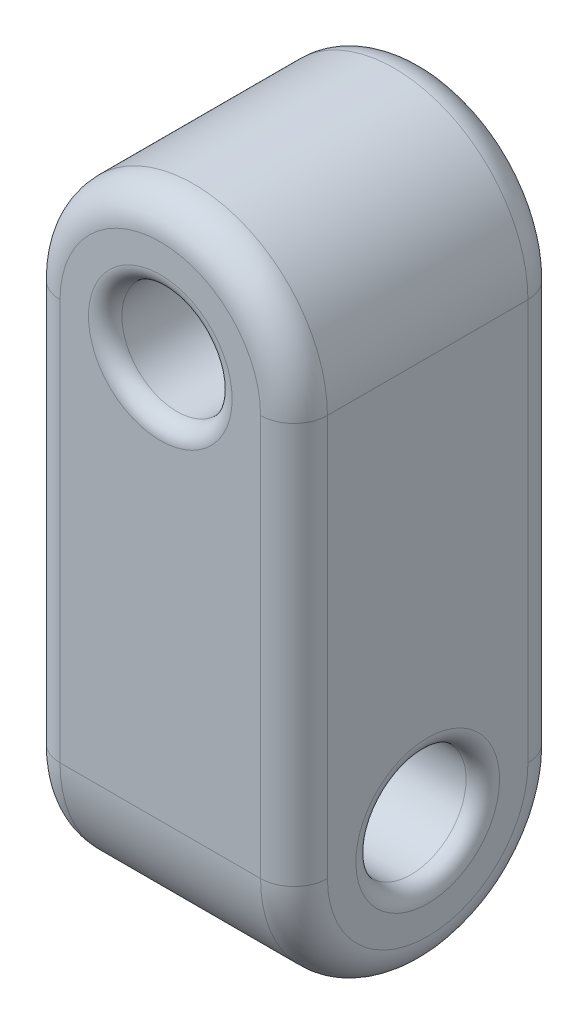
ISO-10303-21;
HEADER;
FILE_DESCRIPTION(('STEP AP214'),'2;1');
FILE_NAME('part.step','',(''),(''),'','','');
FILE_SCHEMA(('AUTOMOTIVE_DESIGN { 1 0 10303 214 1 1 1 1 }'));
ENDSEC;
DATA;
#1=APPLICATION_CONTEXT('core data for automotive mechanical design processes');
#2=APPLICATION_PROTOCOL_DEFINITION('international standard','automotive_design',2000,#1);
#3=PRODUCT_CONTEXT('',#1,'mechanical');
#4=PRODUCT('Part','Part','',(#3));
#5=PRODUCT_RELATED_PRODUCT_CATEGORY('part','',(#4));
#6=PRODUCT_DEFINITION_FORMATION('','',#4);
#7=PRODUCT_DEFINITION_CONTEXT('part definition',#1,'design');
#8=PRODUCT_DEFINITION('design','',#6,#7);
#9=PRODUCT_DEFINITION_SHAPE('','',#8);
#10=(LENGTH_UNIT() NAMED_UNIT(*) SI_UNIT(.MILLI.,.METRE.));
#11=(NAMED_UNIT(*) PLANE_ANGLE_UNIT() SI_UNIT($,.RADIAN.));
#12=(NAMED_UNIT(*) SI_UNIT($,.STERADIAN.) SOLID_ANGLE_UNIT());
#13=UNCERTAINTY_MEASURE_WITH_UNIT(LENGTH_MEASURE(1.E-05),#10,'distance_accuracy_value','');
#14=(GEOMETRIC_REPRESENTATION_CONTEXT(3) GLOBAL_UNCERTAINTY_ASSIGNED_CONTEXT((#13)) GLOBAL_UNIT_ASSIGNED_CONTEXT((#10,
#11,#12)) REPRESENTATION_CONTEXT('',''));
#15=CARTESIAN_POINT('',(0.,0.,0.));
#16=DIRECTION('',(0.,0.,1.));
#17=DIRECTION('',(1.,0.,0.));
#18=AXIS2_PLACEMENT_3D('',#15,#16,#17);
#19=CARTESIAN_POINT('',(0.,0.,8.8));
#20=DIRECTION('',(0.,0.,-1.));
#21=DIRECTION('',(-1.,0.,0.));
#22=AXIS2_PLACEMENT_3D('',#19,#20,#21);
#23=CYLINDRICAL_SURFACE('',#22,4.);
#24=DIRECTION('',(0.,0.,-1.));
#25=VECTOR('',#24,1.);
#26=CARTESIAN_POINT('',(-4.,0.,8.8));
#27=LINE('',#26,#25);
#28=CARTESIAN_POINT('',(-4.,0.,7.8));
#29=VERTEX_POINT('',#28);
#30=CARTESIAN_POINT('',(-4.,0.,1.8));
#31=VERTEX_POINT('',#30);
#32=EDGE_CURVE('E146',#29,#31,#27,.T.);
#33=ORIENTED_EDGE('',*,*,#32,.F.);
#34=CARTESIAN_POINT('',(0.,0.,7.8));
#35=DIRECTION('',(0.,0.,1.));
#36=DIRECTION('',(1.,0.,0.));
#37=AXIS2_PLACEMENT_3D('',#34,#35,#36);
#38=CIRCLE('',#37,4.);
#39=CARTESIAN_POINT('',(4.,0.,7.8));
#40=VERTEX_POINT('',#39);
#41=EDGE_CURVE('E166',#29,#40,#38,.F.);
#42=ORIENTED_EDGE('',*,*,#41,.T.);
#43=DIRECTION('',(0.,0.,-1.));
#44=VECTOR('',#43,1.);
#45=CARTESIAN_POINT('',(4.,0.,8.8));
#46=LINE('',#45,#44);
#47=CARTESIAN_POINT('',(4.,0.,1.8));
#48=VERTEX_POINT('',#47);
#49=EDGE_CURVE('E138',#40,#48,#46,.T.);
#50=ORIENTED_EDGE('',*,*,#49,.T.);
#51=CARTESIAN_POINT('',(0.,0.,1.8));
#52=DIRECTION('',(0.,0.,1.));
#53=DIRECTION('',(1.,0.,0.));
#54=AXIS2_PLACEMENT_3D('',#51,#52,#53);
#55=CIRCLE('',#54,4.);
#56=EDGE_CURVE('E164',#48,#31,#55,.T.);
#57=ORIENTED_EDGE('',*,*,#56,.T.);
#58=EDGE_LOOP('',(#33,#42,#50,#57));
#59=FACE_BOUND('',#58,.T.);
#60=ADVANCED_FACE('F34',(#59),#23,.T.);
#61=CARTESIAN_POINT('',(0.,0.,8.8));
#62=DIRECTION('',(0.,0.,1.));
#63=DIRECTION('',(1.,0.,0.));
#64=AXIS2_PLACEMENT_3D('',#61,#62,#63);
#65=PLANE('',#64);
#66=CARTESIAN_POINT('',(0.,0.,8.8));
#67=DIRECTION('',(0.,0.,1.));
#68=DIRECTION('',(1.,0.,0.));
#69=AXIS2_PLACEMENT_3D('',#66,#67,#68);
#70=CIRCLE('',#69,2.15);
#71=CARTESIAN_POINT('',(2.15,0.,8.8));
#72=VERTEX_POINT('',#71);
#73=EDGE_CURVE('E193',#72,#72,#70,.F.);
#74=ORIENTED_EDGE('',*,*,#73,.T.);
#75=EDGE_LOOP('',(#74));
#76=FACE_BOUND('',#75,.T.);
#77=DIRECTION('',(-1.,0.,0.));
#78=VECTOR('',#77,1.);
#79=CARTESIAN_POINT('',(4.,-12.,8.8));
#80=LINE('',#79,#78);
#81=CARTESIAN_POINT('',(3.,-12.,8.8));
#82=VERTEX_POINT('',#81);
#83=CARTESIAN_POINT('',(-3.,-12.,8.8));
#84=VERTEX_POINT('',#83);
#85=EDGE_CURVE('E135',#82,#84,#80,.T.);
#86=ORIENTED_EDGE('',*,*,#85,.F.);
#87=DIRECTION('',(0.,-1.,0.));
#88=VECTOR('',#87,1.);
#89=CARTESIAN_POINT('',(3.,0.,8.8));
#90=LINE('',#89,#88);
#91=CARTESIAN_POINT('',(3.,0.,8.8));
#92=VERTEX_POINT('',#91);
#93=EDGE_CURVE('E158',#82,#92,#90,.F.);
#94=ORIENTED_EDGE('',*,*,#93,.T.);
#95=CARTESIAN_POINT('',(0.,0.,8.8));
#96=DIRECTION('',(0.,0.,1.));
#97=DIRECTION('',(1.,0.,0.));
#98=AXIS2_PLACEMENT_3D('',#95,#96,#97);
#99=CIRCLE('',#98,3.);
#100=CARTESIAN_POINT('',(-3.,0.,8.8));
#101=VERTEX_POINT('',#100);
#102=EDGE_CURVE('E119',#92,#101,#99,.T.);
#103=ORIENTED_EDGE('',*,*,#102,.T.);
#104=DIRECTION('',(0.,-1.,0.));
#105=VECTOR('',#104,1.);
#106=CARTESIAN_POINT('',(-3.,-12.,8.8));
#107=LINE('',#106,#105);
#108=EDGE_CURVE('E156',#101,#84,#107,.T.);
#109=ORIENTED_EDGE('',*,*,#108,.T.);
#110=EDGE_LOOP('',(#86,#94,#103,#109));
#111=FACE_BOUND('',#110,.T.);
#112=ADVANCED_FACE('F210',(#76,#111),#65,.T.);
#113=CARTESIAN_POINT('',(0.,0.,0.8));
#114=DIRECTION('',(0.,0.,1.));
#115=DIRECTION('',(1.,0.,0.));
#116=AXIS2_PLACEMENT_3D('',#113,#114,#115);
#117=PLANE('',#116);
#118=CARTESIAN_POINT('',(0.,0.,0.8));
#119=DIRECTION('',(0.,0.,1.));
#120=DIRECTION('',(1.,0.,0.));
#121=AXIS2_PLACEMENT_3D('',#118,#119,#120);
#122=CIRCLE('',#121,2.15);
#123=CARTESIAN_POINT('',(2.15,0.,0.8));
#124=VERTEX_POINT('',#123);
#125=EDGE_CURVE('E11',#124,#124,#122,.T.);
#126=ORIENTED_EDGE('',*,*,#125,.T.);
#127=EDGE_LOOP('',(#126));
#128=FACE_BOUND('',#127,.T.);
#129=CARTESIAN_POINT('',(0.,0.,0.8));
#130=DIRECTION('',(0.,0.,1.));
#131=DIRECTION('',(1.,0.,0.));
#132=AXIS2_PLACEMENT_3D('',#129,#130,#131);
#133=CIRCLE('',#132,3.);
#134=CARTESIAN_POINT('',(-3.,0.,0.8));
#135=VERTEX_POINT('',#134);
#136=CARTESIAN_POINT('',(3.,0.,0.8));
#137=VERTEX_POINT('',#136);
#138=EDGE_CURVE('E128',#135,#137,#133,.F.);
#139=ORIENTED_EDGE('',*,*,#138,.T.);
#140=DIRECTION('',(0.,-1.,0.));
#141=VECTOR('',#140,1.);
#142=CARTESIAN_POINT('',(3.,-12.,0.8));
#143=LINE('',#142,#141);
#144=CARTESIAN_POINT('',(3.,-12.,0.8));
#145=VERTEX_POINT('',#144);
#146=EDGE_CURVE('E103',#137,#145,#143,.T.);
#147=ORIENTED_EDGE('',*,*,#146,.T.);
#148=DIRECTION('',(-1.,0.,0.));
#149=VECTOR('',#148,1.);
#150=CARTESIAN_POINT('',(4.,-12.,0.8));
#151=LINE('',#150,#149);
#152=CARTESIAN_POINT('',(-3.,-12.,0.8));
#153=VERTEX_POINT('',#152);
#154=EDGE_CURVE('E125',#145,#153,#151,.T.);
#155=ORIENTED_EDGE('',*,*,#154,.T.);
#156=DIRECTION('',(0.,-1.,0.));
#157=VECTOR('',#156,1.);
#158=CARTESIAN_POINT('',(-3.,0.,0.8));
#159=LINE('',#158,#157);
#160=EDGE_CURVE('E131',#153,#135,#159,.F.);
#161=ORIENTED_EDGE('',*,*,#160,.T.);
#162=EDGE_LOOP('',(#139,#147,#155,#161));
#163=FACE_BOUND('',#162,.T.);
#164=ADVANCED_FACE('F124',(#128,#163),#117,.F.);
#165=CARTESIAN_POINT('',(-4.,0.,8.8));
#166=DIRECTION('',(1.,0.,0.));
#167=DIRECTION('',(0.,0.,-1.));
#168=AXIS2_PLACEMENT_3D('',#165,#166,#167);
#169=PLANE('',#168);
#170=CARTESIAN_POINT('',(-4.,-12.,4.8));
#171=DIRECTION('',(1.,0.,0.));
#172=DIRECTION('',(0.,0.,-1.));
#173=AXIS2_PLACEMENT_3D('',#170,#171,#172);
#174=CIRCLE('',#173,2.15);
#175=CARTESIAN_POINT('',(-4.,-12.,2.65));
#176=VERTEX_POINT('',#175);
#177=EDGE_CURVE('E167',#176,#176,#174,.T.);
#178=ORIENTED_EDGE('',*,*,#177,.T.);
#179=EDGE_LOOP('',(#178));
#180=FACE_BOUND('',#179,.T.);
#181=CARTESIAN_POINT('',(-4.,-12.,4.8));
#182=DIRECTION('',(1.,0.,0.));
#183=DIRECTION('',(0.,0.,-1.));
#184=AXIS2_PLACEMENT_3D('',#181,#182,#183);
#185=CIRCLE('',#184,3.);
#186=CARTESIAN_POINT('',(-4.,-12.,1.8));
#187=VERTEX_POINT('',#186);
#188=CARTESIAN_POINT('',(-4.,-12.,7.8));
#189=VERTEX_POINT('',#188);
#190=EDGE_CURVE('E49',#187,#189,#185,.F.);
#191=ORIENTED_EDGE('',*,*,#190,.T.);
#192=DIRECTION('',(0.,-1.,0.));
#193=VECTOR('',#192,1.);
#194=CARTESIAN_POINT('',(-4.,0.,7.8));
#195=LINE('',#194,#193);
#196=EDGE_CURVE('E162',#189,#29,#195,.F.);
#197=ORIENTED_EDGE('',*,*,#196,.T.);
#198=ORIENTED_EDGE('',*,*,#32,.T.);
#199=DIRECTION('',(0.,-1.,0.));
#200=VECTOR('',#199,1.);
#201=CARTESIAN_POINT('',(-4.,0.,1.8));
#202=LINE('',#201,#200);
#203=EDGE_CURVE('E54',#31,#187,#202,.T.);
#204=ORIENTED_EDGE('',*,*,#203,.T.);
#205=EDGE_LOOP('',(#191,#197,#198,#204));
#206=FACE_BOUND('',#205,.T.);
#207=ADVANCED_FACE('F242',(#180,#206),#169,.F.);
#208=CARTESIAN_POINT('',(4.,0.,8.8));
#209=DIRECTION('',(1.,0.,0.));
#210=DIRECTION('',(0.,1.,0.));
#211=AXIS2_PLACEMENT_3D('',#208,#209,#210);
#212=PLANE('',#211);
#213=CARTESIAN_POINT('',(4.,-12.,4.8));
#214=DIRECTION('',(1.,0.,0.));
#215=DIRECTION('',(0.,1.,0.));
#216=AXIS2_PLACEMENT_3D('',#213,#214,#215);
#217=CIRCLE('',#216,2.15);
#218=CARTESIAN_POINT('',(4.,-9.85,4.8));
#219=VERTEX_POINT('',#218);
#220=EDGE_CURVE('E190',#219,#219,#217,.F.);
#221=ORIENTED_EDGE('',*,*,#220,.T.);
#222=EDGE_LOOP('',(#221));
#223=FACE_BOUND('',#222,.T.);
#224=CARTESIAN_POINT('',(4.,-12.,4.8));
#225=DIRECTION('',(1.,0.,0.));
#226=DIRECTION('',(0.,1.,0.));
#227=AXIS2_PLACEMENT_3D('',#224,#225,#226);
#228=CIRCLE('',#227,3.);
#229=CARTESIAN_POINT('',(4.,-12.,7.8));
#230=VERTEX_POINT('',#229);
#231=CARTESIAN_POINT('',(4.,-12.,1.8));
#232=VERTEX_POINT('',#231);
#233=EDGE_CURVE('E151',#230,#232,#228,.T.);
#234=ORIENTED_EDGE('',*,*,#233,.T.);
#235=DIRECTION('',(0.,-1.,0.));
#236=VECTOR('',#235,1.);
#237=CARTESIAN_POINT('',(4.,0.,1.8));
#238=LINE('',#237,#236);
#239=EDGE_CURVE('E105',#232,#48,#238,.F.);
#240=ORIENTED_EDGE('',*,*,#239,.T.);
#241=ORIENTED_EDGE('',*,*,#49,.F.);
#242=DIRECTION('',(0.,-1.,0.));
#243=VECTOR('',#242,1.);
#244=CARTESIAN_POINT('',(4.,0.,7.8));
#245=LINE('',#244,#243);
#246=EDGE_CURVE('E130',#40,#230,#245,.T.);
#247=ORIENTED_EDGE('',*,*,#246,.T.);
#248=EDGE_LOOP('',(#234,#240,#241,#247));
#249=FACE_BOUND('',#248,.T.);
#250=ADVANCED_FACE('F241',(#223,#249),#212,.T.);
#251=CARTESIAN_POINT('',(-4.,-12.,4.8));
#252=DIRECTION('',(1.,0.,0.));
#253=DIRECTION('',(0.,0.,-1.));
#254=AXIS2_PLACEMENT_3D('',#251,#252,#253);
#255=CYLINDRICAL_SURFACE('',#254,4.);
#256=ORIENTED_EDGE('',*,*,#154,.F.);
#257=CARTESIAN_POINT('',(3.,-12.,4.8));
#258=DIRECTION('',(1.,0.,0.));
#259=DIRECTION('',(0.,1.,0.));
#260=AXIS2_PLACEMENT_3D('',#257,#258,#259);
#261=CIRCLE('',#260,4.);
#262=EDGE_CURVE('E111',#145,#82,#261,.F.);
#263=ORIENTED_EDGE('',*,*,#262,.T.);
#264=ORIENTED_EDGE('',*,*,#85,.T.);
#265=CARTESIAN_POINT('',(-3.,-12.,4.8));
#266=DIRECTION('',(1.,0.,0.));
#267=DIRECTION('',(0.,0.,-1.));
#268=AXIS2_PLACEMENT_3D('',#265,#266,#267);
#269=CIRCLE('',#268,4.);
#270=EDGE_CURVE('E120',#84,#153,#269,.T.);
#271=ORIENTED_EDGE('',*,*,#270,.T.);
#272=EDGE_LOOP('',(#256,#263,#264,#271));
#273=FACE_BOUND('',#272,.T.);
#274=ADVANCED_FACE('F133',(#273),#255,.T.);
#275=CARTESIAN_POINT('',(0.,0.,9.6));
#276=DIRECTION('',(0.,0.,-1.));
#277=DIRECTION('',(-1.,0.,0.));
#278=AXIS2_PLACEMENT_3D('',#275,#276,#277);
#279=CYLINDRICAL_SURFACE('',#278,1.65);
#280=CARTESIAN_POINT('',(0.,0.,8.3));
#281=DIRECTION('',(0.,0.,1.));
#282=DIRECTION('',(1.,0.,0.));
#283=AXIS2_PLACEMENT_3D('',#280,#281,#282);
#284=CIRCLE('',#283,1.65);
#285=CARTESIAN_POINT('',(1.65,0.,8.3));
#286=VERTEX_POINT('',#285);
#287=EDGE_CURVE('E42',#286,#286,#284,.T.);
#288=ORIENTED_EDGE('',*,*,#287,.T.);
#289=EDGE_LOOP('',(#288));
#290=FACE_BOUND('',#289,.T.);
#291=CARTESIAN_POINT('',(0.,0.,1.3));
#292=DIRECTION('',(0.,0.,1.));
#293=DIRECTION('',(1.,0.,0.));
#294=AXIS2_PLACEMENT_3D('',#291,#292,#293);
#295=CIRCLE('',#294,1.65);
#296=CARTESIAN_POINT('',(1.65,0.,1.3));
#297=VERTEX_POINT('',#296);
#298=EDGE_CURVE('E196',#297,#297,#295,.F.);
#299=ORIENTED_EDGE('',*,*,#298,.T.);
#300=EDGE_LOOP('',(#299));
#301=FACE_BOUND('',#300,.T.);
#302=ADVANCED_FACE('F201',(#290,#301),#279,.F.);
#303=CARTESIAN_POINT('',(-4.975,-12.,4.8));
#304=DIRECTION('',(1.,0.,0.));
#305=DIRECTION('',(0.,0.,-1.));
#306=AXIS2_PLACEMENT_3D('',#303,#304,#305);
#307=CYLINDRICAL_SURFACE('',#306,1.65);
#308=CARTESIAN_POINT('',(-3.5,-12.,4.8));
#309=DIRECTION('',(1.,0.,0.));
#310=DIRECTION('',(0.,0.,-1.));
#311=AXIS2_PLACEMENT_3D('',#308,#309,#310);
#312=CIRCLE('',#311,1.65);
#313=CARTESIAN_POINT('',(-3.5,-12.,3.15));
#314=VERTEX_POINT('',#313);
#315=EDGE_CURVE('E187',#314,#314,#312,.F.);
#316=CARTESIAN_POINT('',(3.5,-12.,4.8));
#317=DIRECTION('',(1.,0.,0.));
#318=DIRECTION('',(0.,1.,0.));
#319=AXIS2_PLACEMENT_3D('',#316,#317,#318);
#320=CIRCLE('',#319,1.65);
#321=CARTESIAN_POINT('',(3.5,-12.,3.15));
#322=VERTEX_POINT('',#321);
#323=EDGE_CURVE('E184',#322,#322,#320,.T.);
#324=CARTESIAN_POINT('',(-3.5,-12.,3.15));
#325=CARTESIAN_POINT('',(-3.42708333333333,-12.,3.15));
#326=CARTESIAN_POINT('',(-3.35416666666667,-12.,3.15));
#327=CARTESIAN_POINT('',(-3.20833333333333,-12.,3.15));
#328=CARTESIAN_POINT('',(-3.13541666666667,-12.,3.15));
#329=CARTESIAN_POINT('',(-2.98958333333333,-12.,3.15));
#330=CARTESIAN_POINT('',(-2.91666666666667,-12.,3.15));
#331=CARTESIAN_POINT('',(-2.77083333333333,-12.,3.15));
#332=CARTESIAN_POINT('',(-2.69791666666667,-12.,3.15));
#333=CARTESIAN_POINT('',(-2.55208333333333,-12.,3.15));
#334=CARTESIAN_POINT('',(-2.47916666666667,-12.,3.15));
#335=CARTESIAN_POINT('',(-2.33333333333333,-12.,3.15));
#336=CARTESIAN_POINT('',(-2.26041666666667,-12.,3.15));
#337=CARTESIAN_POINT('',(-2.11458333333333,-12.,3.15));
#338=CARTESIAN_POINT('',(-2.04166666666667,-12.,3.15));
#339=CARTESIAN_POINT('',(-1.89583333333333,-12.,3.15));
#340=CARTESIAN_POINT('',(-1.82291666666667,-12.,3.15));
#341=CARTESIAN_POINT('',(-1.67708333333333,-12.,3.15));
#342=CARTESIAN_POINT('',(-1.60416666666667,-12.,3.15));
#343=CARTESIAN_POINT('',(-1.45833333333333,-12.,3.15));
#344=CARTESIAN_POINT('',(-1.38541666666667,-12.,3.15));
#345=CARTESIAN_POINT('',(-1.23958333333333,-12.,3.15));
#346=CARTESIAN_POINT('',(-1.16666666666667,-12.,3.15));
#347=CARTESIAN_POINT('',(-1.02083333333334,-12.,3.15));
#348=CARTESIAN_POINT('',(-0.947916666666669,-12.,3.15));
#349=CARTESIAN_POINT('',(-0.802083333333336,-12.,3.15));
#350=CARTESIAN_POINT('',(-0.729166666666669,-12.,3.15));
#351=CARTESIAN_POINT('',(-0.583333333333336,-12.,3.15));
#352=CARTESIAN_POINT('',(-0.510416666666669,-12.,3.15));
#353=CARTESIAN_POINT('',(-0.364583333333335,-12.,3.15));
#354=CARTESIAN_POINT('',(-0.291666666666669,-12.,3.15));
#355=CARTESIAN_POINT('',(-0.145833333333335,-12.,3.15));
#356=CARTESIAN_POINT('',(-0.0729166666666684,-12.,3.15));
#357=CARTESIAN_POINT('',(0.0729166666666647,-12.,3.15));
#358=CARTESIAN_POINT('',(0.145833333333331,-12.,3.15));
#359=CARTESIAN_POINT('',(0.291666666666664,-12.,3.15));
#360=CARTESIAN_POINT('',(0.36458333333333,-12.,3.15));
#361=CARTESIAN_POINT('',(0.510416666666664,-12.,3.15));
#362=CARTESIAN_POINT('',(0.58333333333333,-12.,3.15));
#363=CARTESIAN_POINT('',(0.729166666666664,-12.,3.15));
#364=CARTESIAN_POINT('',(0.802083333333331,-12.,3.15));
#365=CARTESIAN_POINT('',(0.947916666666664,-12.,3.15));
#366=CARTESIAN_POINT('',(1.02083333333333,-12.,3.15));
#367=CARTESIAN_POINT('',(1.16666666666666,-12.,3.15));
#368=CARTESIAN_POINT('',(1.23958333333333,-12.,3.15));
#369=CARTESIAN_POINT('',(1.38541666666666,-12.,3.15));
#370=CARTESIAN_POINT('',(1.45833333333333,-12.,3.15));
#371=CARTESIAN_POINT('',(1.60416666666666,-12.,3.15));
#372=CARTESIAN_POINT('',(1.67708333333333,-12.,3.15));
#373=CARTESIAN_POINT('',(1.82291666666666,-12.,3.15));
#374=CARTESIAN_POINT('',(1.89583333333333,-12.,3.15));
#375=CARTESIAN_POINT('',(2.04166666666666,-12.,3.15));
#376=CARTESIAN_POINT('',(2.11458333333333,-12.,3.15));
#377=CARTESIAN_POINT('',(2.26041666666666,-12.,3.15));
#378=CARTESIAN_POINT('',(2.33333333333333,-12.,3.15));
#379=CARTESIAN_POINT('',(2.47916666666666,-12.,3.15));
#380=CARTESIAN_POINT('',(2.55208333333333,-12.,3.15));
#381=CARTESIAN_POINT('',(2.69791666666666,-12.,3.15));
#382=CARTESIAN_POINT('',(2.77083333333333,-12.,3.15));
#383=CARTESIAN_POINT('',(2.91666666666666,-12.,3.15));
#384=CARTESIAN_POINT('',(2.98958333333333,-12.,3.15));
#385=CARTESIAN_POINT('',(3.13541666666666,-12.,3.15));
#386=CARTESIAN_POINT('',(3.20833333333333,-12.,3.15));
#387=CARTESIAN_POINT('',(3.35416666666666,-12.,3.15));
#388=CARTESIAN_POINT('',(3.42708333333333,-12.,3.15));
#389=CARTESIAN_POINT('',(3.5,-12.,3.15));
#390=B_SPLINE_CURVE_WITH_KNOTS('',3,(#324,#325,#326,#327,#328,#329,#330,#331,#332,#333,#334,
#335,#336,#337,#338,#339,#340,#341,#342,#343,#344,#345,#346,#347,#348,#349,#350,#351,#352,#353,
#354,#355,#356,#357,#358,#359,#360,#361,#362,#363,#364,#365,#366,#367,#368,#369,#370,#371,#372,
#373,#374,#375,#376,#377,#378,#379,#380,#381,#382,#383,#384,#385,#386,#387,#388,#389),
.UNSPECIFIED.,.F.,.F.,(4,2,2,2,2,2,2,2,2,2,2,2,2,2,2,2,2,2,2,2,2,2,2,2,2,2,2,2,2,2,2,2,4),(0.,
0.21875,0.4375,0.65625,0.874999999999999,1.09375,1.3125,1.53125,1.75,1.96875,2.1875,2.40625,
2.625,2.84375,3.0625,3.28125,3.5,3.71875,3.9375,4.15625,4.375,4.59375,4.8125,5.03125,5.25,
5.46875,5.6875,5.90625,6.125,6.34375,6.5625,6.78125,7.),.UNSPECIFIED.);
#391=EDGE_CURVE('BSEAM276',#314,#322,#390,.T.);
#392=ORIENTED_EDGE('',*,*,#315,.T.);
#393=ORIENTED_EDGE('',*,*,#323,.T.);
#394=ORIENTED_EDGE('',*,*,#391,.T.);
#395=ORIENTED_EDGE('',*,*,#391,.F.);
#396=EDGE_LOOP('',(#392,#394,#393,#395));
#397=FACE_BOUND('',#396,.T.);
#398=ADVANCED_FACE('F276',(#397),#307,.F.);
#399=CARTESIAN_POINT('',(-3.,0.,7.8));
#400=DIRECTION('',(0.,1.,0.));
#401=DIRECTION('',(0.,0.,1.));
#402=AXIS2_PLACEMENT_3D('',#399,#400,#401);
#403=CYLINDRICAL_SURFACE('',#402,1.);
#404=CARTESIAN_POINT('',(-3.,0.,7.8));
#405=DIRECTION('',(0.,1.,0.));
#406=DIRECTION('',(0.,0.,1.));
#407=AXIS2_PLACEMENT_3D('',#404,#405,#406);
#408=CIRCLE('',#407,1.);
#409=EDGE_CURVE('E141',#29,#101,#408,.T.);
#410=ORIENTED_EDGE('',*,*,#409,.F.);
#411=ORIENTED_EDGE('',*,*,#196,.F.);
#412=CARTESIAN_POINT('',(-3.,-12.,7.8));
#413=DIRECTION('',(0.,-1.,0.));
#414=DIRECTION('',(0.,0.,-1.));
#415=AXIS2_PLACEMENT_3D('',#412,#413,#414);
#416=CIRCLE('',#415,1.);
#417=EDGE_CURVE('E136',#84,#189,#416,.T.);
#418=ORIENTED_EDGE('',*,*,#417,.F.);
#419=ORIENTED_EDGE('',*,*,#108,.F.);
#420=EDGE_LOOP('',(#410,#411,#418,#419));
#421=FACE_BOUND('',#420,.T.);
#422=ADVANCED_FACE('F227',(#421),#403,.T.);
#423=CARTESIAN_POINT('',(-3.,-12.,4.8));
#424=DIRECTION('',(1.,0.,0.));
#425=DIRECTION('',(0.,0.,-1.));
#426=AXIS2_PLACEMENT_3D('',#423,#424,#425);
#427=TOROIDAL_SURFACE('',#426,3.,1.);
#428=ORIENTED_EDGE('',*,*,#417,.T.);
#429=ORIENTED_EDGE('',*,*,#190,.F.);
#430=CARTESIAN_POINT('',(-3.,-12.,1.8));
#431=DIRECTION('',(0.,1.,0.));
#432=DIRECTION('',(0.,0.,1.));
#433=AXIS2_PLACEMENT_3D('',#430,#431,#432);
#434=CIRCLE('',#433,1.);
#435=EDGE_CURVE('E177',#153,#187,#434,.T.);
#436=ORIENTED_EDGE('',*,*,#435,.F.);
#437=ORIENTED_EDGE('',*,*,#270,.F.);
#438=EDGE_LOOP('',(#428,#429,#436,#437));
#439=FACE_BOUND('',#438,.T.);
#440=ADVANCED_FACE('F229',(#439),#427,.T.);
#441=CARTESIAN_POINT('',(0.,0.,7.8));
#442=DIRECTION('',(0.,0.,1.));
#443=DIRECTION('',(1.,0.,0.));
#444=AXIS2_PLACEMENT_3D('',#441,#442,#443);
#445=TOROIDAL_SURFACE('',#444,3.,1.);
#446=ORIENTED_EDGE('',*,*,#409,.T.);
#447=ORIENTED_EDGE('',*,*,#102,.F.);
#448=CARTESIAN_POINT('',(3.,0.,7.8));
#449=DIRECTION('',(0.,-1.,0.));
#450=DIRECTION('',(0.,0.,-1.));
#451=AXIS2_PLACEMENT_3D('',#448,#449,#450);
#452=CIRCLE('',#451,1.);
#453=EDGE_CURVE('E174',#40,#92,#452,.T.);
#454=ORIENTED_EDGE('',*,*,#453,.F.);
#455=ORIENTED_EDGE('',*,*,#41,.F.);
#456=EDGE_LOOP('',(#446,#447,#454,#455));
#457=FACE_BOUND('',#456,.T.);
#458=ADVANCED_FACE('F224',(#457),#445,.T.);
#459=CARTESIAN_POINT('',(-3.,0.,1.8));
#460=DIRECTION('',(0.,-1.,0.));
#461=DIRECTION('',(0.,0.,-1.));
#462=AXIS2_PLACEMENT_3D('',#459,#460,#461);
#463=CYLINDRICAL_SURFACE('',#462,1.);
#464=ORIENTED_EDGE('',*,*,#435,.T.);
#465=ORIENTED_EDGE('',*,*,#203,.F.);
#466=CARTESIAN_POINT('',(-3.,0.,1.8));
#467=DIRECTION('',(0.,1.,0.));
#468=DIRECTION('',(0.,0.,1.));
#469=AXIS2_PLACEMENT_3D('',#466,#467,#468);
#470=CIRCLE('',#469,1.);
#471=EDGE_CURVE('E171',#135,#31,#470,.T.);
#472=ORIENTED_EDGE('',*,*,#471,.F.);
#473=ORIENTED_EDGE('',*,*,#160,.F.);
#474=EDGE_LOOP('',(#464,#465,#472,#473));
#475=FACE_BOUND('',#474,.T.);
#476=ADVANCED_FACE('F233',(#475),#463,.T.);
#477=CARTESIAN_POINT('',(3.,0.,7.8));
#478=DIRECTION('',(0.,-1.,0.));
#479=DIRECTION('',(1.,0.,0.));
#480=AXIS2_PLACEMENT_3D('',#477,#478,#479);
#481=CYLINDRICAL_SURFACE('',#480,1.);
#482=ORIENTED_EDGE('',*,*,#453,.T.);
#483=ORIENTED_EDGE('',*,*,#93,.F.);
#484=CARTESIAN_POINT('',(3.,-12.,7.8));
#485=DIRECTION('',(0.,-1.,0.));
#486=DIRECTION('',(0.,0.,-1.));
#487=AXIS2_PLACEMENT_3D('',#484,#485,#486);
#488=CIRCLE('',#487,1.);
#489=EDGE_CURVE('E114',#230,#82,#488,.T.);
#490=ORIENTED_EDGE('',*,*,#489,.F.);
#491=ORIENTED_EDGE('',*,*,#246,.F.);
#492=EDGE_LOOP('',(#482,#483,#490,#491));
#493=FACE_BOUND('',#492,.T.);
#494=ADVANCED_FACE('F219',(#493),#481,.T.);
#495=CARTESIAN_POINT('',(0.,0.,1.8));
#496=DIRECTION('',(0.,0.,1.));
#497=DIRECTION('',(1.,0.,0.));
#498=AXIS2_PLACEMENT_3D('',#495,#496,#497);
#499=TOROIDAL_SURFACE('',#498,3.,1.);
#500=ORIENTED_EDGE('',*,*,#471,.T.);
#501=ORIENTED_EDGE('',*,*,#56,.F.);
#502=CARTESIAN_POINT('',(3.,0.,1.8));
#503=DIRECTION('',(0.,-1.,0.));
#504=DIRECTION('',(1.,0.,0.));
#505=AXIS2_PLACEMENT_3D('',#502,#503,#504);
#506=CIRCLE('',#505,1.);
#507=EDGE_CURVE('E108',#137,#48,#506,.T.);
#508=ORIENTED_EDGE('',*,*,#507,.F.);
#509=ORIENTED_EDGE('',*,*,#138,.F.);
#510=EDGE_LOOP('',(#500,#501,#508,#509));
#511=FACE_BOUND('',#510,.T.);
#512=ADVANCED_FACE('F236',(#511),#499,.T.);
#513=CARTESIAN_POINT('',(3.,-12.,4.8));
#514=DIRECTION('',(1.,0.,0.));
#515=DIRECTION('',(0.,1.,0.));
#516=AXIS2_PLACEMENT_3D('',#513,#514,#515);
#517=TOROIDAL_SURFACE('',#516,3.,1.);
#518=ORIENTED_EDGE('',*,*,#489,.T.);
#519=ORIENTED_EDGE('',*,*,#262,.F.);
#520=CARTESIAN_POINT('',(3.,-12.,1.8));
#521=DIRECTION('',(0.,1.,0.));
#522=DIRECTION('',(0.,0.,1.));
#523=AXIS2_PLACEMENT_3D('',#520,#521,#522);
#524=CIRCLE('',#523,1.);
#525=EDGE_CURVE('E99',#232,#145,#524,.T.);
#526=ORIENTED_EDGE('',*,*,#525,.F.);
#527=ORIENTED_EDGE('',*,*,#233,.F.);
#528=EDGE_LOOP('',(#518,#519,#526,#527));
#529=FACE_BOUND('',#528,.T.);
#530=ADVANCED_FACE('F112',(#529),#517,.T.);
#531=CARTESIAN_POINT('',(3.,0.,1.8));
#532=DIRECTION('',(0.,1.,0.));
#533=DIRECTION('',(-1.,0.,0.));
#534=AXIS2_PLACEMENT_3D('',#531,#532,#533);
#535=CYLINDRICAL_SURFACE('',#534,1.);
#536=ORIENTED_EDGE('',*,*,#507,.T.);
#537=ORIENTED_EDGE('',*,*,#239,.F.);
#538=ORIENTED_EDGE('',*,*,#525,.T.);
#539=ORIENTED_EDGE('',*,*,#146,.F.);
#540=EDGE_LOOP('',(#536,#537,#538,#539));
#541=FACE_BOUND('',#540,.T.);
#542=ADVANCED_FACE('F101',(#541),#535,.T.);
#543=CARTESIAN_POINT('',(-3.5,-12.,4.8));
#544=DIRECTION('',(1.,0.,0.));
#545=DIRECTION('',(0.,0.,-1.));
#546=AXIS2_PLACEMENT_3D('',#543,#544,#545);
#547=TOROIDAL_SURFACE('',#546,2.15,0.5);
#548=ORIENTED_EDGE('',*,*,#315,.F.);
#549=EDGE_LOOP('',(#548));
#550=FACE_BOUND('',#549,.T.);
#551=ORIENTED_EDGE('',*,*,#177,.F.);
#552=EDGE_LOOP('',(#551));
#553=FACE_BOUND('',#552,.T.);
#554=ADVANCED_FACE('F261',(#550,#553),#547,.T.);
#555=CARTESIAN_POINT('',(3.5,-12.,4.8));
#556=DIRECTION('',(1.,0.,0.));
#557=DIRECTION('',(0.,1.,0.));
#558=AXIS2_PLACEMENT_3D('',#555,#556,#557);
#559=TOROIDAL_SURFACE('',#558,2.15,0.5);
#560=ORIENTED_EDGE('',*,*,#220,.F.);
#561=EDGE_LOOP('',(#560));
#562=FACE_BOUND('',#561,.T.);
#563=ORIENTED_EDGE('',*,*,#323,.F.);
#564=EDGE_LOOP('',(#563));
#565=FACE_BOUND('',#564,.T.);
#566=ADVANCED_FACE('F207',(#562,#565),#559,.T.);
#567=CARTESIAN_POINT('',(0.,0.,8.3));
#568=DIRECTION('',(0.,0.,1.));
#569=DIRECTION('',(1.,0.,0.));
#570=AXIS2_PLACEMENT_3D('',#567,#568,#569);
#571=TOROIDAL_SURFACE('',#570,2.15,0.5);
#572=ORIENTED_EDGE('',*,*,#287,.F.);
#573=EDGE_LOOP('',(#572));
#574=FACE_BOUND('',#573,.T.);
#575=ORIENTED_EDGE('',*,*,#73,.F.);
#576=EDGE_LOOP('',(#575));
#577=FACE_BOUND('',#576,.T.);
#578=ADVANCED_FACE('F204',(#574,#577),#571,.T.);
#579=CARTESIAN_POINT('',(0.,0.,1.3));
#580=DIRECTION('',(0.,0.,1.));
#581=DIRECTION('',(1.,0.,0.));
#582=AXIS2_PLACEMENT_3D('',#579,#580,#581);
#583=TOROIDAL_SURFACE('',#582,2.15,0.5);
#584=ORIENTED_EDGE('',*,*,#125,.F.);
#585=EDGE_LOOP('',(#584));
#586=FACE_BOUND('',#585,.T.);
#587=ORIENTED_EDGE('',*,*,#298,.F.);
#588=EDGE_LOOP('',(#587));
#589=FACE_BOUND('',#588,.T.);
#590=ADVANCED_FACE('F36',(#586,#589),#583,.T.);
#591=CLOSED_SHELL('',(#60,#112,#164,#207,#250,#274,#302,#398,#422,#440,#458,#476,#494,#512,#530,
#542,#554,#566,#578,#590));
#592=MANIFOLD_SOLID_BREP('B2',#591);
#593=ADVANCED_BREP_SHAPE_REPRESENTATION('',(#18,#592),#14);
#594=SHAPE_DEFINITION_REPRESENTATION(#9,#593);
ENDSEC;
END-ISO-10303-21;
